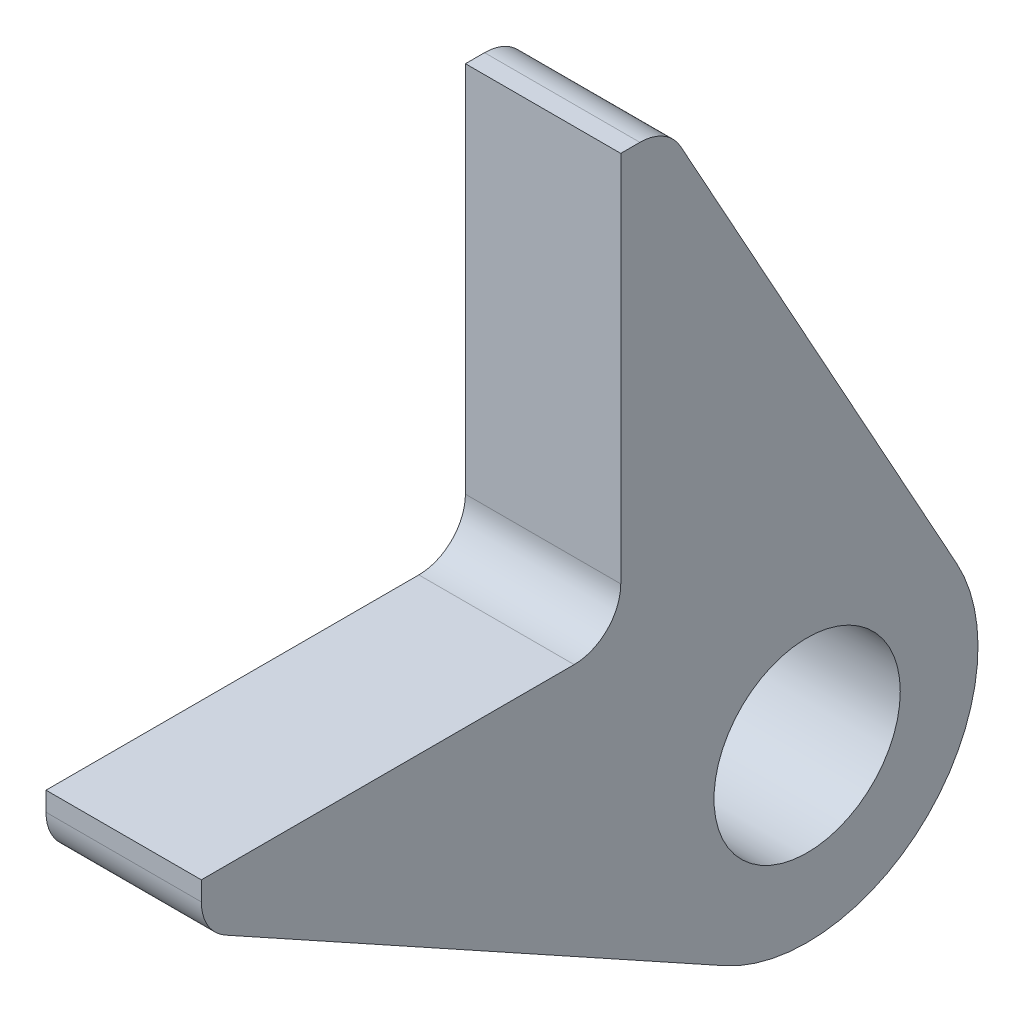
ISO-10303-21;
HEADER;
FILE_DESCRIPTION(('STEP AP214'),'2;1');
FILE_NAME('part.step','',(''),(''),'','','');
FILE_SCHEMA(('AUTOMOTIVE_DESIGN { 1 0 10303 214 1 1 1 1 }'));
ENDSEC;
DATA;
#1=APPLICATION_CONTEXT('core data for automotive mechanical design processes');
#2=APPLICATION_PROTOCOL_DEFINITION('international standard','automotive_design',2000,#1);
#3=PRODUCT_CONTEXT('',#1,'mechanical');
#4=PRODUCT('Part','Part','',(#3));
#5=PRODUCT_RELATED_PRODUCT_CATEGORY('part','',(#4));
#6=PRODUCT_DEFINITION_FORMATION('','',#4);
#7=PRODUCT_DEFINITION_CONTEXT('part definition',#1,'design');
#8=PRODUCT_DEFINITION('design','',#6,#7);
#9=PRODUCT_DEFINITION_SHAPE('','',#8);
#10=(LENGTH_UNIT() NAMED_UNIT(*) SI_UNIT(.MILLI.,.METRE.));
#11=(NAMED_UNIT(*) PLANE_ANGLE_UNIT() SI_UNIT($,.RADIAN.));
#12=(NAMED_UNIT(*) SI_UNIT($,.STERADIAN.) SOLID_ANGLE_UNIT());
#13=UNCERTAINTY_MEASURE_WITH_UNIT(LENGTH_MEASURE(1.E-05),#10,'distance_accuracy_value','');
#14=(GEOMETRIC_REPRESENTATION_CONTEXT(3) GLOBAL_UNCERTAINTY_ASSIGNED_CONTEXT((#13)) GLOBAL_UNIT_ASSIGNED_CONTEXT((#10,
#11,#12)) REPRESENTATION_CONTEXT('',''));
#15=CARTESIAN_POINT('',(0.,0.,0.));
#16=DIRECTION('',(0.,0.,1.));
#17=DIRECTION('',(1.,0.,0.));
#18=AXIS2_PLACEMENT_3D('',#15,#16,#17);
#19=CARTESIAN_POINT('',(15.875,114.290421481312,34.1822750972357));
#20=DIRECTION('',(1.,0.,0.));
#21=DIRECTION('',(0.,0.,-1.));
#22=AXIS2_PLACEMENT_3D('',#19,#20,#21);
#23=PLANE('',#22);
#24=DIRECTION('',(0.,0.,1.));
#25=VECTOR('',#24,1.);
#26=CARTESIAN_POINT('',(15.875,123.815421481312,38.0904214813123));
#27=LINE('',#26,#25);
#28=CARTESIAN_POINT('',(15.875,123.815421481312,34.1822750972357));
#29=VERTEX_POINT('',#28);
#30=CARTESIAN_POINT('',(15.875,123.815421481312,38.0904214813123));
#31=VERTEX_POINT('',#30);
#32=EDGE_CURVE('E152',#29,#31,#27,.T.);
#33=ORIENTED_EDGE('',*,*,#32,.T.);
#34=DIRECTION('',(0.,-1.,0.));
#35=VECTOR('',#34,1.);
#36=CARTESIAN_POINT('',(15.875,123.815421481312,38.0904214813123));
#37=LINE('',#36,#35);
#38=CARTESIAN_POINT('',(15.875,47.6154214813118,38.0904214813123));
#39=VERTEX_POINT('',#38);
#40=EDGE_CURVE('E125',#31,#39,#37,.T.);
#41=ORIENTED_EDGE('',*,*,#40,.T.);
#42=CARTESIAN_POINT('',(15.875,47.6154214813118,47.6154214813123));
#43=DIRECTION('',(-1.,0.,0.));
#44=DIRECTION('',(0.,0.,-1.));
#45=AXIS2_PLACEMENT_3D('',#42,#43,#44);
#46=CIRCLE('',#45,9.525);
#47=CARTESIAN_POINT('',(15.875,38.0904214813118,47.6154214813123));
#48=VERTEX_POINT('',#47);
#49=EDGE_CURVE('E155',#39,#48,#46,.T.);
#50=ORIENTED_EDGE('',*,*,#49,.T.);
#51=DIRECTION('',(0.,0.,1.));
#52=VECTOR('',#51,1.);
#53=CARTESIAN_POINT('',(15.875,38.0904214813118,47.6154214813123));
#54=LINE('',#53,#52);
#55=CARTESIAN_POINT('',(15.875,38.0904214813117,123.815421481312));
#56=VERTEX_POINT('',#55);
#57=EDGE_CURVE('E157',#48,#56,#54,.T.);
#58=ORIENTED_EDGE('',*,*,#57,.T.);
#59=DIRECTION('',(0.,-1.,0.));
#60=VECTOR('',#59,1.);
#61=CARTESIAN_POINT('',(15.875,38.0904214813117,123.815421481312));
#62=LINE('',#61,#60);
#63=CARTESIAN_POINT('',(15.875,34.182275097235,123.815421481312));
#64=VERTEX_POINT('',#63);
#65=EDGE_CURVE('E159',#56,#64,#62,.T.);
#66=ORIENTED_EDGE('',*,*,#65,.T.);
#67=CARTESIAN_POINT('',(15.875,34.182275097235,114.290421481312));
#68=DIRECTION('',(1.,0.,0.));
#69=DIRECTION('',(0.,0.,1.));
#70=AXIS2_PLACEMENT_3D('',#67,#68,#69);
#71=CIRCLE('',#70,9.525);
#72=CARTESIAN_POINT('',(15.875,25.8470645954368,118.90018187538));
#73=VERTEX_POINT('',#72);
#74=EDGE_CURVE('E161',#64,#73,#71,.T.);
#75=ORIENTED_EDGE('',*,*,#74,.T.);
#76=DIRECTION('',(0.,-0.483964345833853,-0.875087716724221));
#77=VECTOR('',#76,1.);
#78=CARTESIAN_POINT('',(15.875,25.8470645954368,118.90018187538));
#79=LINE('',#78,#77);
#80=CARTESIAN_POINT('',(15.875,-30.5624385065934,16.9024547782473));
#81=VERTEX_POINT('',#80);
#82=EDGE_CURVE('E163',#73,#81,#79,.T.);
#83=ORIENTED_EDGE('',*,*,#82,.T.);
#84=CARTESIAN_POINT('',(15.875,0.,0.));
#85=DIRECTION('',(1.,0.,0.));
#86=DIRECTION('',(0.,0.,-1.));
#87=AXIS2_PLACEMENT_3D('',#84,#85,#86);
#88=CIRCLE('',#87,34.925);
#89=CARTESIAN_POINT('',(15.875,16.9024547782475,-30.5624385065933));
#90=VERTEX_POINT('',#89);
#91=EDGE_CURVE('E165',#81,#90,#88,.T.);
#92=ORIENTED_EDGE('',*,*,#91,.T.);
#93=DIRECTION('',(0.,0.875087716724218,0.48396434583386));
#94=VECTOR('',#93,1.);
#95=CARTESIAN_POINT('',(15.875,118.900181875379,25.8470645954376));
#96=LINE('',#95,#94);
#97=CARTESIAN_POINT('',(15.875,118.900181875379,25.8470645954376));
#98=VERTEX_POINT('',#97);
#99=EDGE_CURVE('E54',#90,#98,#96,.T.);
#100=ORIENTED_EDGE('',*,*,#99,.T.);
#101=CARTESIAN_POINT('',(15.875,114.290421481312,34.1822750972357));
#102=DIRECTION('',(1.,0.,0.));
#103=DIRECTION('',(0.,0.,-1.));
#104=AXIS2_PLACEMENT_3D('',#101,#102,#103);
#105=CIRCLE('',#104,9.525);
#106=EDGE_CURVE('E49',#98,#29,#105,.T.);
#107=ORIENTED_EDGE('',*,*,#106,.T.);
#108=EDGE_LOOP('',(#33,#41,#50,#58,#66,#75,#83,#92,#100,#107));
#109=FACE_BOUND('',#108,.T.);
#110=CARTESIAN_POINT('',(15.875,0.,0.));
#111=DIRECTION('',(1.,0.,0.));
#112=DIRECTION('',(0.,0.,-1.));
#113=AXIS2_PLACEMENT_3D('',#110,#111,#112);
#114=CIRCLE('',#113,19.0373);
#115=CARTESIAN_POINT('',(15.875,0.,-19.0373));
#116=VERTEX_POINT('',#115);
#117=EDGE_CURVE('E130',#116,#116,#114,.T.);
#118=ORIENTED_EDGE('',*,*,#117,.F.);
#119=EDGE_LOOP('',(#118));
#120=FACE_BOUND('',#119,.T.);
#121=ADVANCED_FACE('F34',(#109,#120),#23,.T.);
#122=CARTESIAN_POINT('',(-15.875,114.290421481312,34.1822750972357));
#123=DIRECTION('',(1.,0.,0.));
#124=DIRECTION('',(0.,0.,-1.));
#125=AXIS2_PLACEMENT_3D('',#122,#123,#124);
#126=PLANE('',#125);
#127=DIRECTION('',(0.,0.,1.));
#128=VECTOR('',#127,1.);
#129=CARTESIAN_POINT('',(-15.875,123.815421481312,38.0904214813123));
#130=LINE('',#129,#128);
#131=CARTESIAN_POINT('',(-15.875,123.815421481312,34.1822750972357));
#132=VERTEX_POINT('',#131);
#133=CARTESIAN_POINT('',(-15.875,123.815421481312,38.0904214813123));
#134=VERTEX_POINT('',#133);
#135=EDGE_CURVE('E116',#132,#134,#130,.T.);
#136=ORIENTED_EDGE('',*,*,#135,.F.);
#137=CARTESIAN_POINT('',(-15.875,114.290421481312,34.1822750972357));
#138=DIRECTION('',(1.,0.,0.));
#139=DIRECTION('',(0.,0.,-1.));
#140=AXIS2_PLACEMENT_3D('',#137,#138,#139);
#141=CIRCLE('',#140,9.525);
#142=CARTESIAN_POINT('',(-15.875,118.900181875379,25.8470645954376));
#143=VERTEX_POINT('',#142);
#144=EDGE_CURVE('E150',#143,#132,#141,.T.);
#145=ORIENTED_EDGE('',*,*,#144,.F.);
#146=DIRECTION('',(0.,0.875087716724218,0.48396434583386));
#147=VECTOR('',#146,1.);
#148=CARTESIAN_POINT('',(-15.875,118.900181875379,25.8470645954376));
#149=LINE('',#148,#147);
#150=CARTESIAN_POINT('',(-15.875,16.9024547782475,-30.5624385065933));
#151=VERTEX_POINT('',#150);
#152=EDGE_CURVE('E148',#151,#143,#149,.T.);
#153=ORIENTED_EDGE('',*,*,#152,.F.);
#154=CARTESIAN_POINT('',(-15.875,0.,0.));
#155=DIRECTION('',(1.,0.,0.));
#156=DIRECTION('',(0.,0.,-1.));
#157=AXIS2_PLACEMENT_3D('',#154,#155,#156);
#158=CIRCLE('',#157,34.925);
#159=CARTESIAN_POINT('',(-15.875,-30.5624385065934,16.9024547782473));
#160=VERTEX_POINT('',#159);
#161=EDGE_CURVE('E146',#160,#151,#158,.T.);
#162=ORIENTED_EDGE('',*,*,#161,.F.);
#163=DIRECTION('',(0.,-0.483964345833853,-0.875087716724221));
#164=VECTOR('',#163,1.);
#165=CARTESIAN_POINT('',(-15.875,25.8470645954368,118.90018187538));
#166=LINE('',#165,#164);
#167=CARTESIAN_POINT('',(-15.875,25.8470645954368,118.90018187538));
#168=VERTEX_POINT('',#167);
#169=EDGE_CURVE('E144',#168,#160,#166,.T.);
#170=ORIENTED_EDGE('',*,*,#169,.F.);
#171=CARTESIAN_POINT('',(-15.875,34.182275097235,114.290421481312));
#172=DIRECTION('',(1.,0.,0.));
#173=DIRECTION('',(0.,0.,1.));
#174=AXIS2_PLACEMENT_3D('',#171,#172,#173);
#175=CIRCLE('',#174,9.525);
#176=CARTESIAN_POINT('',(-15.875,34.182275097235,123.815421481312));
#177=VERTEX_POINT('',#176);
#178=EDGE_CURVE('E142',#177,#168,#175,.T.);
#179=ORIENTED_EDGE('',*,*,#178,.F.);
#180=DIRECTION('',(0.,-1.,0.));
#181=VECTOR('',#180,1.);
#182=CARTESIAN_POINT('',(-15.875,38.0904214813117,123.815421481312));
#183=LINE('',#182,#181);
#184=CARTESIAN_POINT('',(-15.875,38.0904214813117,123.815421481312));
#185=VERTEX_POINT('',#184);
#186=EDGE_CURVE('E140',#185,#177,#183,.T.);
#187=ORIENTED_EDGE('',*,*,#186,.F.);
#188=DIRECTION('',(0.,0.,1.));
#189=VECTOR('',#188,1.);
#190=CARTESIAN_POINT('',(-15.875,38.0904214813118,47.6154214813123));
#191=LINE('',#190,#189);
#192=CARTESIAN_POINT('',(-15.875,38.0904214813118,47.6154214813123));
#193=VERTEX_POINT('',#192);
#194=EDGE_CURVE('E138',#193,#185,#191,.T.);
#195=ORIENTED_EDGE('',*,*,#194,.F.);
#196=CARTESIAN_POINT('',(-15.875,47.6154214813118,47.6154214813123));
#197=DIRECTION('',(-1.,0.,0.));
#198=DIRECTION('',(0.,0.,-1.));
#199=AXIS2_PLACEMENT_3D('',#196,#197,#198);
#200=CIRCLE('',#199,9.525);
#201=CARTESIAN_POINT('',(-15.875,47.6154214813118,38.0904214813123));
#202=VERTEX_POINT('',#201);
#203=EDGE_CURVE('E118',#202,#193,#200,.T.);
#204=ORIENTED_EDGE('',*,*,#203,.F.);
#205=DIRECTION('',(0.,-1.,0.));
#206=VECTOR('',#205,1.);
#207=CARTESIAN_POINT('',(-15.875,123.815421481312,38.0904214813123));
#208=LINE('',#207,#206);
#209=EDGE_CURVE('E111',#134,#202,#208,.T.);
#210=ORIENTED_EDGE('',*,*,#209,.F.);
#211=EDGE_LOOP('',(#136,#145,#153,#162,#170,#179,#187,#195,#204,#210));
#212=FACE_BOUND('',#211,.T.);
#213=CARTESIAN_POINT('',(-15.875,0.,0.));
#214=DIRECTION('',(1.,0.,0.));
#215=DIRECTION('',(0.,0.,-1.));
#216=AXIS2_PLACEMENT_3D('',#213,#214,#215);
#217=CIRCLE('',#216,19.0373);
#218=CARTESIAN_POINT('',(-15.875,0.,-19.0373));
#219=VERTEX_POINT('',#218);
#220=EDGE_CURVE('E133',#219,#219,#217,.T.);
#221=ORIENTED_EDGE('',*,*,#220,.T.);
#222=EDGE_LOOP('',(#221));
#223=FACE_BOUND('',#222,.T.);
#224=ADVANCED_FACE('F112',(#212,#223),#126,.F.);
#225=CARTESIAN_POINT('',(15.875,123.815421481312,38.0904214813123));
#226=DIRECTION('',(0.,-1.,0.));
#227=DIRECTION('',(0.,0.,-1.));
#228=AXIS2_PLACEMENT_3D('',#225,#226,#227);
#229=PLANE('',#228);
#230=ORIENTED_EDGE('',*,*,#135,.T.);
#231=DIRECTION('',(-1.,0.,0.));
#232=VECTOR('',#231,1.);
#233=CARTESIAN_POINT('',(15.875,123.815421481312,38.0904214813123));
#234=LINE('',#233,#232);
#235=EDGE_CURVE('E11',#31,#134,#234,.T.);
#236=ORIENTED_EDGE('',*,*,#235,.F.);
#237=ORIENTED_EDGE('',*,*,#32,.F.);
#238=DIRECTION('',(-1.,0.,0.));
#239=VECTOR('',#238,1.);
#240=CARTESIAN_POINT('',(15.875,123.815421481312,34.1822750972357));
#241=LINE('',#240,#239);
#242=EDGE_CURVE('E129',#29,#132,#241,.T.);
#243=ORIENTED_EDGE('',*,*,#242,.T.);
#244=EDGE_LOOP('',(#230,#236,#237,#243));
#245=FACE_BOUND('',#244,.T.);
#246=ADVANCED_FACE('F36',(#245),#229,.F.);
#247=CARTESIAN_POINT('',(15.875,123.815421481312,38.0904214813123));
#248=DIRECTION('',(0.,0.,-1.));
#249=DIRECTION('',(0.,1.,0.));
#250=AXIS2_PLACEMENT_3D('',#247,#248,#249);
#251=PLANE('',#250);
#252=ORIENTED_EDGE('',*,*,#209,.T.);
#253=DIRECTION('',(-1.,0.,0.));
#254=VECTOR('',#253,1.);
#255=CARTESIAN_POINT('',(15.875,47.6154214813118,38.0904214813123));
#256=LINE('',#255,#254);
#257=EDGE_CURVE('E42',#39,#202,#256,.T.);
#258=ORIENTED_EDGE('',*,*,#257,.F.);
#259=ORIENTED_EDGE('',*,*,#40,.F.);
#260=ORIENTED_EDGE('',*,*,#235,.T.);
#261=EDGE_LOOP('',(#252,#258,#259,#260));
#262=FACE_BOUND('',#261,.T.);
#263=ADVANCED_FACE('F124',(#262),#251,.F.);
#264=CARTESIAN_POINT('',(15.875,47.6154214813118,47.6154214813123));
#265=DIRECTION('',(-1.,0.,0.));
#266=DIRECTION('',(0.,0.,1.));
#267=AXIS2_PLACEMENT_3D('',#264,#265,#266);
#268=CYLINDRICAL_SURFACE('',#267,9.525);
#269=ORIENTED_EDGE('',*,*,#203,.T.);
#270=DIRECTION('',(-1.,0.,0.));
#271=VECTOR('',#270,1.);
#272=CARTESIAN_POINT('',(15.875,38.0904214813118,47.6154214813123));
#273=LINE('',#272,#271);
#274=EDGE_CURVE('E188',#48,#193,#273,.T.);
#275=ORIENTED_EDGE('',*,*,#274,.F.);
#276=ORIENTED_EDGE('',*,*,#49,.F.);
#277=ORIENTED_EDGE('',*,*,#257,.T.);
#278=EDGE_LOOP('',(#269,#275,#276,#277));
#279=FACE_BOUND('',#278,.T.);
#280=ADVANCED_FACE('F192',(#279),#268,.F.);
#281=CARTESIAN_POINT('',(15.875,38.0904214813118,47.6154214813123));
#282=DIRECTION('',(0.,-1.,0.));
#283=DIRECTION('',(0.,0.,-1.));
#284=AXIS2_PLACEMENT_3D('',#281,#282,#283);
#285=PLANE('',#284);
#286=ORIENTED_EDGE('',*,*,#194,.T.);
#287=DIRECTION('',(-1.,0.,0.));
#288=VECTOR('',#287,1.);
#289=CARTESIAN_POINT('',(15.875,38.0904214813117,123.815421481312));
#290=LINE('',#289,#288);
#291=EDGE_CURVE('E185',#56,#185,#290,.T.);
#292=ORIENTED_EDGE('',*,*,#291,.F.);
#293=ORIENTED_EDGE('',*,*,#57,.F.);
#294=ORIENTED_EDGE('',*,*,#274,.T.);
#295=EDGE_LOOP('',(#286,#292,#293,#294));
#296=FACE_BOUND('',#295,.T.);
#297=ADVANCED_FACE('F200',(#296),#285,.F.);
#298=CARTESIAN_POINT('',(15.875,38.0904214813117,123.815421481312));
#299=DIRECTION('',(0.,0.,-1.));
#300=DIRECTION('',(0.,1.,0.));
#301=AXIS2_PLACEMENT_3D('',#298,#299,#300);
#302=PLANE('',#301);
#303=ORIENTED_EDGE('',*,*,#186,.T.);
#304=DIRECTION('',(-1.,0.,0.));
#305=VECTOR('',#304,1.);
#306=CARTESIAN_POINT('',(15.875,34.182275097235,123.815421481312));
#307=LINE('',#306,#305);
#308=EDGE_CURVE('E182',#64,#177,#307,.T.);
#309=ORIENTED_EDGE('',*,*,#308,.F.);
#310=ORIENTED_EDGE('',*,*,#65,.F.);
#311=ORIENTED_EDGE('',*,*,#291,.T.);
#312=EDGE_LOOP('',(#303,#309,#310,#311));
#313=FACE_BOUND('',#312,.T.);
#314=ADVANCED_FACE('F203',(#313),#302,.F.);
#315=CARTESIAN_POINT('',(15.875,34.182275097235,114.290421481312));
#316=DIRECTION('',(-1.,0.,0.));
#317=DIRECTION('',(0.,0.,1.));
#318=AXIS2_PLACEMENT_3D('',#315,#316,#317);
#319=CYLINDRICAL_SURFACE('',#318,9.525);
#320=ORIENTED_EDGE('',*,*,#178,.T.);
#321=DIRECTION('',(-1.,0.,0.));
#322=VECTOR('',#321,1.);
#323=CARTESIAN_POINT('',(15.875,25.8470645954368,118.90018187538));
#324=LINE('',#323,#322);
#325=EDGE_CURVE('E179',#73,#168,#324,.T.);
#326=ORIENTED_EDGE('',*,*,#325,.F.);
#327=ORIENTED_EDGE('',*,*,#74,.F.);
#328=ORIENTED_EDGE('',*,*,#308,.T.);
#329=EDGE_LOOP('',(#320,#326,#327,#328));
#330=FACE_BOUND('',#329,.T.);
#331=ADVANCED_FACE('F208',(#330),#319,.T.);
#332=CARTESIAN_POINT('',(15.875,25.8470645954368,118.90018187538));
#333=DIRECTION('',(0.,0.875087716724221,-0.483964345833853));
#334=DIRECTION('',(0.,0.483964345833853,0.875087716724222));
#335=AXIS2_PLACEMENT_3D('',#332,#333,#334);
#336=PLANE('',#335);
#337=ORIENTED_EDGE('',*,*,#169,.T.);
#338=DIRECTION('',(-1.,0.,0.));
#339=VECTOR('',#338,1.);
#340=CARTESIAN_POINT('',(15.875,-30.5624385065934,16.9024547782473));
#341=LINE('',#340,#339);
#342=EDGE_CURVE('E176',#81,#160,#341,.T.);
#343=ORIENTED_EDGE('',*,*,#342,.F.);
#344=ORIENTED_EDGE('',*,*,#82,.F.);
#345=ORIENTED_EDGE('',*,*,#325,.T.);
#346=EDGE_LOOP('',(#337,#343,#344,#345));
#347=FACE_BOUND('',#346,.T.);
#348=ADVANCED_FACE('F214',(#347),#336,.F.);
#349=CARTESIAN_POINT('',(15.875,0.,0.));
#350=DIRECTION('',(-1.,0.,0.));
#351=DIRECTION('',(0.,0.,1.));
#352=AXIS2_PLACEMENT_3D('',#349,#350,#351);
#353=CYLINDRICAL_SURFACE('',#352,34.925);
#354=ORIENTED_EDGE('',*,*,#161,.T.);
#355=DIRECTION('',(-1.,0.,0.));
#356=VECTOR('',#355,1.);
#357=CARTESIAN_POINT('',(15.875,16.9024547782475,-30.5624385065933));
#358=LINE('',#357,#356);
#359=EDGE_CURVE('E173',#90,#151,#358,.T.);
#360=ORIENTED_EDGE('',*,*,#359,.F.);
#361=ORIENTED_EDGE('',*,*,#91,.F.);
#362=ORIENTED_EDGE('',*,*,#342,.T.);
#363=EDGE_LOOP('',(#354,#360,#361,#362));
#364=FACE_BOUND('',#363,.T.);
#365=ADVANCED_FACE('F218',(#364),#353,.T.);
#366=CARTESIAN_POINT('',(15.875,118.900181875379,25.8470645954376));
#367=DIRECTION('',(0.,-0.48396434583386,0.875087716724218));
#368=DIRECTION('',(0.,-0.875087716724218,-0.48396434583386));
#369=AXIS2_PLACEMENT_3D('',#366,#367,#368);
#370=PLANE('',#369);
#371=ORIENTED_EDGE('',*,*,#152,.T.);
#372=DIRECTION('',(-1.,0.,0.));
#373=VECTOR('',#372,1.);
#374=CARTESIAN_POINT('',(15.875,118.900181875379,25.8470645954376));
#375=LINE('',#374,#373);
#376=EDGE_CURVE('E170',#98,#143,#375,.T.);
#377=ORIENTED_EDGE('',*,*,#376,.F.);
#378=ORIENTED_EDGE('',*,*,#99,.F.);
#379=ORIENTED_EDGE('',*,*,#359,.T.);
#380=EDGE_LOOP('',(#371,#377,#378,#379));
#381=FACE_BOUND('',#380,.T.);
#382=ADVANCED_FACE('F221',(#381),#370,.F.);
#383=CARTESIAN_POINT('',(15.875,114.290421481312,34.1822750972357));
#384=DIRECTION('',(-1.,0.,0.));
#385=DIRECTION('',(0.,0.,1.));
#386=AXIS2_PLACEMENT_3D('',#383,#384,#385);
#387=CYLINDRICAL_SURFACE('',#386,9.525);
#388=ORIENTED_EDGE('',*,*,#144,.T.);
#389=ORIENTED_EDGE('',*,*,#242,.F.);
#390=ORIENTED_EDGE('',*,*,#106,.F.);
#391=ORIENTED_EDGE('',*,*,#376,.T.);
#392=EDGE_LOOP('',(#388,#389,#390,#391));
#393=FACE_BOUND('',#392,.T.);
#394=ADVANCED_FACE('F223',(#393),#387,.T.);
#395=CARTESIAN_POINT('',(15.875,0.,0.));
#396=DIRECTION('',(-1.,0.,0.));
#397=DIRECTION('',(0.,0.,1.));
#398=AXIS2_PLACEMENT_3D('',#395,#396,#397);
#399=CYLINDRICAL_SURFACE('',#398,19.0373);
#400=ORIENTED_EDGE('',*,*,#117,.T.);
#401=EDGE_LOOP('',(#400));
#402=FACE_BOUND('',#401,.T.);
#403=ORIENTED_EDGE('',*,*,#220,.F.);
#404=EDGE_LOOP('',(#403));
#405=FACE_BOUND('',#404,.T.);
#406=ADVANCED_FACE('F225',(#402,#405),#399,.F.);
#407=CLOSED_SHELL('',(#121,#224,#246,#263,#280,#297,#314,#331,#348,#365,#382,#394,#406));
#408=MANIFOLD_SOLID_BREP('B2',#407);
#409=ADVANCED_BREP_SHAPE_REPRESENTATION('',(#18,#408),#14);
#410=SHAPE_DEFINITION_REPRESENTATION(#9,#409);
ENDSEC;
END-ISO-10303-21;
